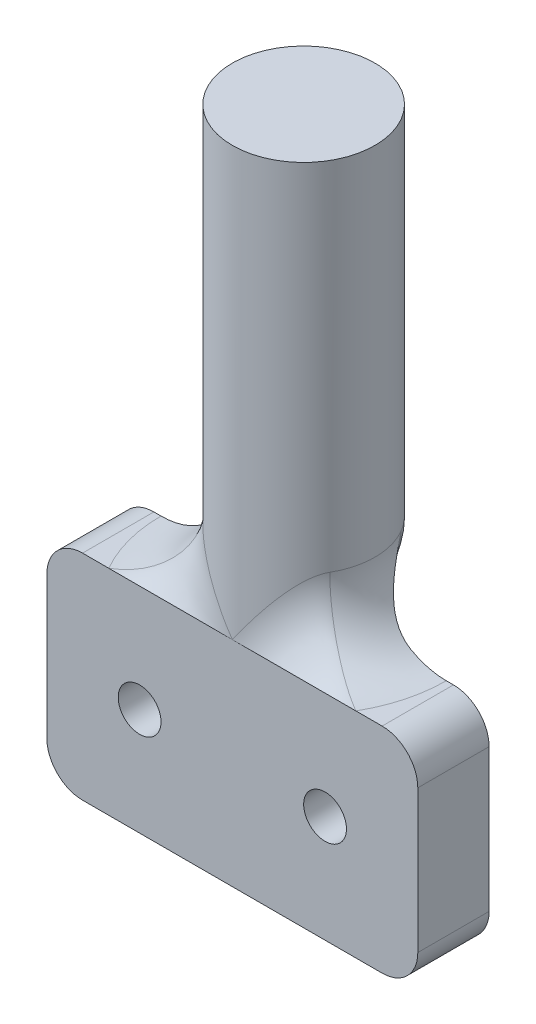
ISO-10303-21;
HEADER;
FILE_DESCRIPTION(('STEP AP214'),'2;1');
FILE_NAME('part.step','',(''),(''),'','','');
FILE_SCHEMA(('AUTOMOTIVE_DESIGN { 1 0 10303 214 1 1 1 1 }'));
ENDSEC;
DATA;
#1=APPLICATION_CONTEXT('core data for automotive mechanical design processes');
#2=APPLICATION_PROTOCOL_DEFINITION('international standard','automotive_design',2000,#1);
#3=PRODUCT_CONTEXT('',#1,'mechanical');
#4=PRODUCT('Part','Part','',(#3));
#5=PRODUCT_RELATED_PRODUCT_CATEGORY('part','',(#4));
#6=PRODUCT_DEFINITION_FORMATION('','',#4);
#7=PRODUCT_DEFINITION_CONTEXT('part definition',#1,'design');
#8=PRODUCT_DEFINITION('design','',#6,#7);
#9=PRODUCT_DEFINITION_SHAPE('','',#8);
#10=(LENGTH_UNIT() NAMED_UNIT(*) SI_UNIT(.MILLI.,.METRE.));
#11=(NAMED_UNIT(*) PLANE_ANGLE_UNIT() SI_UNIT($,.RADIAN.));
#12=(NAMED_UNIT(*) SI_UNIT($,.STERADIAN.) SOLID_ANGLE_UNIT());
#13=UNCERTAINTY_MEASURE_WITH_UNIT(LENGTH_MEASURE(1.E-05),#10,'distance_accuracy_value','');
#14=(GEOMETRIC_REPRESENTATION_CONTEXT(3) GLOBAL_UNCERTAINTY_ASSIGNED_CONTEXT((#13)) GLOBAL_UNIT_ASSIGNED_CONTEXT((#10,
#11,#12)) REPRESENTATION_CONTEXT('',''));
#15=CARTESIAN_POINT('',(0.,0.,0.));
#16=DIRECTION('',(0.,0.,1.));
#17=DIRECTION('',(1.,0.,0.));
#18=AXIS2_PLACEMENT_3D('',#15,#16,#17);
#19=CARTESIAN_POINT('',(0.,15.,5.));
#20=DIRECTION('',(0.,-1.,0.));
#21=DIRECTION('',(0.,0.,-1.));
#22=AXIS2_PLACEMENT_3D('',#19,#20,#21);
#23=PLANE('',#22);
#24=DIRECTION('',(-1.,0.,0.));
#25=VECTOR('',#24,1.);
#26=CARTESIAN_POINT('',(0.,15.,5.));
#27=LINE('',#26,#25);
#28=CARTESIAN_POINT('',(4.33974596215561,15.,5.));
#29=VERTEX_POINT('',#28);
#30=CARTESIAN_POINT('',(2.5,15.,5.));
#31=VERTEX_POINT('',#30);
#32=EDGE_CURVE('E353',#29,#31,#27,.T.);
#33=ORIENTED_EDGE('',*,*,#32,.F.);
#34=CARTESIAN_POINT('',(13.,15.,0.));
#35=DIRECTION('',(0.,-1.,0.));
#36=DIRECTION('',(0.,0.,-1.));
#37=AXIS2_PLACEMENT_3D('',#34,#35,#36);
#38=CIRCLE('',#37,10.);
#39=CARTESIAN_POINT('',(3.,15.,0.));
#40=VERTEX_POINT('',#39);
#41=EDGE_CURVE('E339',#29,#40,#38,.T.);
#42=ORIENTED_EDGE('',*,*,#41,.T.);
#43=DIRECTION('',(-1.,0.,0.));
#44=VECTOR('',#43,1.);
#45=CARTESIAN_POINT('',(0.,15.,0.));
#46=LINE('',#45,#44);
#47=CARTESIAN_POINT('',(2.5,15.,0.));
#48=VERTEX_POINT('',#47);
#49=EDGE_CURVE('E170',#40,#48,#46,.T.);
#50=ORIENTED_EDGE('',*,*,#49,.T.);
#51=DIRECTION('',(0.,0.,-1.));
#52=VECTOR('',#51,1.);
#53=CARTESIAN_POINT('',(2.5,15.,5.));
#54=LINE('',#53,#52);
#55=EDGE_CURVE('E162',#48,#31,#54,.F.);
#56=ORIENTED_EDGE('',*,*,#55,.T.);
#57=EDGE_LOOP('',(#33,#42,#50,#56));
#58=FACE_BOUND('',#57,.T.);
#59=ADVANCED_FACE('F38',(#58),#23,.F.);
#60=CARTESIAN_POINT('',(0.,0.,5.));
#61=DIRECTION('',(0.,0.,-1.));
#62=DIRECTION('',(-1.,0.,0.));
#63=AXIS2_PLACEMENT_3D('',#60,#61,#62);
#64=PLANE('',#63);
#65=DIRECTION('',(0.,1.,0.));
#66=VECTOR('',#65,1.);
#67=CARTESIAN_POINT('',(26.,0.,5.));
#68=LINE('',#67,#66);
#69=CARTESIAN_POINT('',(26.,2.5,5.));
#70=VERTEX_POINT('',#69);
#71=CARTESIAN_POINT('',(26.,12.5,5.));
#72=VERTEX_POINT('',#71);
#73=EDGE_CURVE('E359',#70,#72,#68,.T.);
#74=ORIENTED_EDGE('',*,*,#73,.T.);
#75=CARTESIAN_POINT('',(23.5,12.5,5.));
#76=DIRECTION('',(0.,0.,-1.));
#77=DIRECTION('',(-1.,0.,0.));
#78=AXIS2_PLACEMENT_3D('',#75,#76,#77);
#79=CIRCLE('',#78,2.5);
#80=CARTESIAN_POINT('',(23.5,15.,5.));
#81=VERTEX_POINT('',#80);
#82=EDGE_CURVE('E195',#72,#81,#79,.F.);
#83=ORIENTED_EDGE('',*,*,#82,.T.);
#84=CARTESIAN_POINT('',(21.6602540378444,15.,5.));
#85=VERTEX_POINT('',#84);
#86=EDGE_CURVE('E160',#81,#85,#27,.T.);
#87=ORIENTED_EDGE('',*,*,#86,.T.);
#88=CARTESIAN_POINT('',(13.,15.,5.));
#89=VERTEX_POINT('',#88);
#90=EDGE_CURVE('E352',#85,#89,#27,.T.);
#91=ORIENTED_EDGE('',*,*,#90,.T.);
#92=EDGE_CURVE('E349',#89,#29,#27,.T.);
#93=ORIENTED_EDGE('',*,*,#92,.T.);
#94=ORIENTED_EDGE('',*,*,#32,.T.);
#95=CARTESIAN_POINT('',(2.5,12.5,5.));
#96=DIRECTION('',(0.,0.,-1.));
#97=DIRECTION('',(-1.,0.,0.));
#98=AXIS2_PLACEMENT_3D('',#95,#96,#97);
#99=CIRCLE('',#98,2.5);
#100=CARTESIAN_POINT('',(0.,12.5,5.));
#101=VERTEX_POINT('',#100);
#102=EDGE_CURVE('E189',#31,#101,#99,.F.);
#103=ORIENTED_EDGE('',*,*,#102,.T.);
#104=DIRECTION('',(0.,-1.,0.));
#105=VECTOR('',#104,1.);
#106=CARTESIAN_POINT('',(0.,0.,5.));
#107=LINE('',#106,#105);
#108=CARTESIAN_POINT('',(0.,2.5,5.));
#109=VERTEX_POINT('',#108);
#110=EDGE_CURVE('E169',#101,#109,#107,.T.);
#111=ORIENTED_EDGE('',*,*,#110,.T.);
#112=CARTESIAN_POINT('',(2.5,2.5,5.));
#113=DIRECTION('',(0.,0.,-1.));
#114=DIRECTION('',(-1.,0.,0.));
#115=AXIS2_PLACEMENT_3D('',#112,#113,#114);
#116=CIRCLE('',#115,2.5);
#117=CARTESIAN_POINT('',(2.5,0.,5.));
#118=VERTEX_POINT('',#117);
#119=EDGE_CURVE('E191',#109,#118,#116,.F.);
#120=ORIENTED_EDGE('',*,*,#119,.T.);
#121=DIRECTION('',(1.,0.,0.));
#122=VECTOR('',#121,1.);
#123=CARTESIAN_POINT('',(0.,0.,5.));
#124=LINE('',#123,#122);
#125=CARTESIAN_POINT('',(23.5,0.,5.));
#126=VERTEX_POINT('',#125);
#127=EDGE_CURVE('E173',#118,#126,#124,.T.);
#128=ORIENTED_EDGE('',*,*,#127,.T.);
#129=CARTESIAN_POINT('',(23.5,2.5,5.));
#130=DIRECTION('',(0.,0.,-1.));
#131=DIRECTION('',(-1.,0.,0.));
#132=AXIS2_PLACEMENT_3D('',#129,#130,#131);
#133=CIRCLE('',#132,2.5);
#134=EDGE_CURVE('E193',#126,#70,#133,.F.);
#135=ORIENTED_EDGE('',*,*,#134,.T.);
#136=EDGE_LOOP('',(#74,#83,#87,#91,#93,#94,#103,#111,#120,#128,#135));
#137=FACE_BOUND('',#136,.T.);
#138=CARTESIAN_POINT('',(6.5,7.5,5.));
#139=DIRECTION('',(0.,0.,1.));
#140=DIRECTION('',(1.,0.,0.));
#141=AXIS2_PLACEMENT_3D('',#138,#139,#140);
#142=CIRCLE('',#141,1.5);
#143=CARTESIAN_POINT('',(8.,7.5,5.));
#144=VERTEX_POINT('',#143);
#145=EDGE_CURVE('E364',#144,#144,#142,.T.);
#146=ORIENTED_EDGE('',*,*,#145,.F.);
#147=EDGE_LOOP('',(#146));
#148=FACE_BOUND('',#147,.T.);
#149=CARTESIAN_POINT('',(19.5,7.5,5.));
#150=DIRECTION('',(0.,0.,1.));
#151=DIRECTION('',(1.,0.,0.));
#152=AXIS2_PLACEMENT_3D('',#149,#150,#151);
#153=CIRCLE('',#152,1.5);
#154=CARTESIAN_POINT('',(21.,7.5,5.));
#155=VERTEX_POINT('',#154);
#156=EDGE_CURVE('E385',#155,#155,#153,.T.);
#157=ORIENTED_EDGE('',*,*,#156,.F.);
#158=EDGE_LOOP('',(#157));
#159=FACE_BOUND('',#158,.T.);
#160=ADVANCED_FACE('F307',(#137,#148,#159),#64,.F.);
#161=CARTESIAN_POINT('',(0.,0.,0.));
#162=DIRECTION('',(0.,0.,-1.));
#163=DIRECTION('',(-1.,0.,0.));
#164=AXIS2_PLACEMENT_3D('',#161,#162,#163);
#165=PLANE('',#164);
#166=CARTESIAN_POINT('',(6.5,7.5,0.));
#167=DIRECTION('',(0.,0.,1.));
#168=DIRECTION('',(1.,0.,0.));
#169=AXIS2_PLACEMENT_3D('',#166,#167,#168);
#170=CIRCLE('',#169,1.5);
#171=CARTESIAN_POINT('',(8.,7.5,0.));
#172=VERTEX_POINT('',#171);
#173=EDGE_CURVE('E382',#172,#172,#170,.T.);
#174=ORIENTED_EDGE('',*,*,#173,.T.);
#175=EDGE_LOOP('',(#174));
#176=FACE_BOUND('',#175,.T.);
#177=CARTESIAN_POINT('',(13.,20.,0.));
#178=DIRECTION('',(0.,0.,-1.));
#179=DIRECTION('',(-1.,0.,0.));
#180=AXIS2_PLACEMENT_3D('',#177,#178,#179);
#181=CIRCLE('',#180,8.66025403784439);
#182=CARTESIAN_POINT('',(5.5,15.6698729810778,0.));
#183=VERTEX_POINT('',#182);
#184=CARTESIAN_POINT('',(13.,11.3397459621556,0.));
#185=VERTEX_POINT('',#184);
#186=EDGE_CURVE('E275',#183,#185,#181,.F.);
#187=ORIENTED_EDGE('',*,*,#186,.T.);
#188=CARTESIAN_POINT('',(13.,20.,0.));
#189=DIRECTION('',(0.,0.,-1.));
#190=DIRECTION('',(-1.,0.,0.));
#191=AXIS2_PLACEMENT_3D('',#188,#189,#190);
#192=CIRCLE('',#191,8.66025403784439);
#193=CARTESIAN_POINT('',(20.5,15.6698729810778,0.));
#194=VERTEX_POINT('',#193);
#195=EDGE_CURVE('E325',#185,#194,#192,.F.);
#196=ORIENTED_EDGE('',*,*,#195,.T.);
#197=CARTESIAN_POINT('',(23.,20.,0.));
#198=DIRECTION('',(0.,0.,-1.));
#199=DIRECTION('',(-1.,0.,0.));
#200=AXIS2_PLACEMENT_3D('',#197,#198,#199);
#201=CIRCLE('',#200,5.);
#202=CARTESIAN_POINT('',(23.,15.,0.));
#203=VERTEX_POINT('',#202);
#204=EDGE_CURVE('E168',#194,#203,#201,.F.);
#205=ORIENTED_EDGE('',*,*,#204,.T.);
#206=CARTESIAN_POINT('',(23.5,15.,0.));
#207=VERTEX_POINT('',#206);
#208=EDGE_CURVE('E157',#207,#203,#46,.T.);
#209=ORIENTED_EDGE('',*,*,#208,.F.);
#210=CARTESIAN_POINT('',(23.5,12.5,0.));
#211=DIRECTION('',(0.,0.,-1.));
#212=DIRECTION('',(-1.,0.,0.));
#213=AXIS2_PLACEMENT_3D('',#210,#211,#212);
#214=CIRCLE('',#213,2.5);
#215=CARTESIAN_POINT('',(26.,12.5,0.));
#216=VERTEX_POINT('',#215);
#217=EDGE_CURVE('E140',#207,#216,#214,.T.);
#218=ORIENTED_EDGE('',*,*,#217,.T.);
#219=DIRECTION('',(0.,1.,0.));
#220=VECTOR('',#219,1.);
#221=CARTESIAN_POINT('',(26.,0.,0.));
#222=LINE('',#221,#220);
#223=CARTESIAN_POINT('',(26.,2.5,0.));
#224=VERTEX_POINT('',#223);
#225=EDGE_CURVE('E175',#224,#216,#222,.T.);
#226=ORIENTED_EDGE('',*,*,#225,.F.);
#227=CARTESIAN_POINT('',(23.5,2.5,0.));
#228=DIRECTION('',(0.,0.,-1.));
#229=DIRECTION('',(-1.,0.,0.));
#230=AXIS2_PLACEMENT_3D('',#227,#228,#229);
#231=CIRCLE('',#230,2.5);
#232=CARTESIAN_POINT('',(23.5,0.,0.));
#233=VERTEX_POINT('',#232);
#234=EDGE_CURVE('E151',#224,#233,#231,.T.);
#235=ORIENTED_EDGE('',*,*,#234,.T.);
#236=DIRECTION('',(1.,0.,0.));
#237=VECTOR('',#236,1.);
#238=CARTESIAN_POINT('',(0.,0.,0.));
#239=LINE('',#238,#237);
#240=CARTESIAN_POINT('',(2.5,0.,0.));
#241=VERTEX_POINT('',#240);
#242=EDGE_CURVE('E363',#241,#233,#239,.T.);
#243=ORIENTED_EDGE('',*,*,#242,.F.);
#244=CARTESIAN_POINT('',(2.5,2.5,0.));
#245=DIRECTION('',(0.,0.,-1.));
#246=DIRECTION('',(-1.,0.,0.));
#247=AXIS2_PLACEMENT_3D('',#244,#245,#246);
#248=CIRCLE('',#247,2.5);
#249=CARTESIAN_POINT('',(0.,2.5,0.));
#250=VERTEX_POINT('',#249);
#251=EDGE_CURVE('E183',#241,#250,#248,.T.);
#252=ORIENTED_EDGE('',*,*,#251,.T.);
#253=DIRECTION('',(0.,-1.,0.));
#254=VECTOR('',#253,1.);
#255=CARTESIAN_POINT('',(0.,0.,0.));
#256=LINE('',#255,#254);
#257=CARTESIAN_POINT('',(0.,12.5,0.));
#258=VERTEX_POINT('',#257);
#259=EDGE_CURVE('E361',#258,#250,#256,.T.);
#260=ORIENTED_EDGE('',*,*,#259,.F.);
#261=CARTESIAN_POINT('',(2.5,12.5,0.));
#262=DIRECTION('',(0.,0.,-1.));
#263=DIRECTION('',(-1.,0.,0.));
#264=AXIS2_PLACEMENT_3D('',#261,#262,#263);
#265=CIRCLE('',#264,2.5);
#266=EDGE_CURVE('E161',#258,#48,#265,.T.);
#267=ORIENTED_EDGE('',*,*,#266,.T.);
#268=ORIENTED_EDGE('',*,*,#49,.F.);
#269=CARTESIAN_POINT('',(3.,20.,0.));
#270=DIRECTION('',(0.,0.,-1.));
#271=DIRECTION('',(-1.,0.,0.));
#272=AXIS2_PLACEMENT_3D('',#269,#270,#271);
#273=CIRCLE('',#272,5.);
#274=EDGE_CURVE('E334',#40,#183,#273,.F.);
#275=ORIENTED_EDGE('',*,*,#274,.T.);
#276=EDGE_LOOP('',(#187,#196,#205,#209,#218,#226,#235,#243,#252,#260,#267,#268,#275));
#277=FACE_BOUND('',#276,.T.);
#278=CARTESIAN_POINT('',(19.5,7.5,0.));
#279=DIRECTION('',(0.,0.,1.));
#280=DIRECTION('',(1.,0.,0.));
#281=AXIS2_PLACEMENT_3D('',#278,#279,#280);
#282=CIRCLE('',#281,1.5);
#283=CARTESIAN_POINT('',(21.,7.5,0.));
#284=VERTEX_POINT('',#283);
#285=EDGE_CURVE('E388',#284,#284,#282,.T.);
#286=ORIENTED_EDGE('',*,*,#285,.T.);
#287=EDGE_LOOP('',(#286));
#288=FACE_BOUND('',#287,.T.);
#289=ADVANCED_FACE('F164',(#176,#277,#288),#165,.T.);
#290=CARTESIAN_POINT('',(0.,0.,5.));
#291=DIRECTION('',(1.,0.,0.));
#292=DIRECTION('',(0.,0.,-1.));
#293=AXIS2_PLACEMENT_3D('',#290,#291,#292);
#294=PLANE('',#293);
#295=ORIENTED_EDGE('',*,*,#259,.T.);
#296=DIRECTION('',(0.,0.,-1.));
#297=VECTOR('',#296,1.);
#298=CARTESIAN_POINT('',(0.,2.5,5.));
#299=LINE('',#298,#297);
#300=EDGE_CURVE('E205',#250,#109,#299,.F.);
#301=ORIENTED_EDGE('',*,*,#300,.T.);
#302=ORIENTED_EDGE('',*,*,#110,.F.);
#303=DIRECTION('',(0.,0.,-1.));
#304=VECTOR('',#303,1.);
#305=CARTESIAN_POINT('',(0.,12.5,5.));
#306=LINE('',#305,#304);
#307=EDGE_CURVE('E202',#101,#258,#306,.T.);
#308=ORIENTED_EDGE('',*,*,#307,.T.);
#309=EDGE_LOOP('',(#295,#301,#302,#308));
#310=FACE_BOUND('',#309,.T.);
#311=ADVANCED_FACE('F416',(#310),#294,.F.);
#312=CARTESIAN_POINT('',(0.,0.,5.));
#313=DIRECTION('',(0.,1.,0.));
#314=DIRECTION('',(0.,0.,1.));
#315=AXIS2_PLACEMENT_3D('',#312,#313,#314);
#316=PLANE('',#315);
#317=ORIENTED_EDGE('',*,*,#242,.T.);
#318=DIRECTION('',(0.,0.,-1.));
#319=VECTOR('',#318,1.);
#320=CARTESIAN_POINT('',(23.5,0.,5.));
#321=LINE('',#320,#319);
#322=EDGE_CURVE('E200',#233,#126,#321,.F.);
#323=ORIENTED_EDGE('',*,*,#322,.T.);
#324=ORIENTED_EDGE('',*,*,#127,.F.);
#325=DIRECTION('',(0.,0.,-1.));
#326=VECTOR('',#325,1.);
#327=CARTESIAN_POINT('',(2.5,0.,5.));
#328=LINE('',#327,#326);
#329=EDGE_CURVE('E197',#118,#241,#328,.T.);
#330=ORIENTED_EDGE('',*,*,#329,.T.);
#331=EDGE_LOOP('',(#317,#323,#324,#330));
#332=FACE_BOUND('',#331,.T.);
#333=ADVANCED_FACE('F378',(#332),#316,.F.);
#334=CARTESIAN_POINT('',(26.,0.,5.));
#335=DIRECTION('',(-1.,0.,0.));
#336=DIRECTION('',(0.,0.,1.));
#337=AXIS2_PLACEMENT_3D('',#334,#335,#336);
#338=PLANE('',#337);
#339=ORIENTED_EDGE('',*,*,#225,.T.);
#340=DIRECTION('',(0.,0.,-1.));
#341=VECTOR('',#340,1.);
#342=CARTESIAN_POINT('',(26.,12.5,5.));
#343=LINE('',#342,#341);
#344=EDGE_CURVE('E145',#216,#72,#343,.F.);
#345=ORIENTED_EDGE('',*,*,#344,.T.);
#346=ORIENTED_EDGE('',*,*,#73,.F.);
#347=DIRECTION('',(0.,0.,-1.));
#348=VECTOR('',#347,1.);
#349=CARTESIAN_POINT('',(26.,2.5,5.));
#350=LINE('',#349,#348);
#351=EDGE_CURVE('E150',#70,#224,#350,.T.);
#352=ORIENTED_EDGE('',*,*,#351,.T.);
#353=EDGE_LOOP('',(#339,#345,#346,#352));
#354=FACE_BOUND('',#353,.T.);
#355=ADVANCED_FACE('F370',(#354),#338,.F.);
#356=ORIENTED_EDGE('',*,*,#208,.T.);
#357=CARTESIAN_POINT('',(13.,15.,0.));
#358=DIRECTION('',(0.,-1.,0.));
#359=DIRECTION('',(0.,0.,-1.));
#360=AXIS2_PLACEMENT_3D('',#357,#358,#359);
#361=CIRCLE('',#360,10.);
#362=EDGE_CURVE('E335',#203,#85,#361,.T.);
#363=ORIENTED_EDGE('',*,*,#362,.T.);
#364=ORIENTED_EDGE('',*,*,#86,.F.);
#365=DIRECTION('',(0.,0.,-1.));
#366=VECTOR('',#365,1.);
#367=CARTESIAN_POINT('',(23.5,15.,5.));
#368=LINE('',#367,#366);
#369=EDGE_CURVE('E144',#81,#207,#368,.T.);
#370=ORIENTED_EDGE('',*,*,#369,.T.);
#371=EDGE_LOOP('',(#356,#363,#364,#370));
#372=FACE_BOUND('',#371,.T.);
#373=ADVANCED_FACE('F156',(#372),#23,.F.);
#374=CARTESIAN_POINT('',(6.5,7.5,5.));
#375=DIRECTION('',(0.,0.,-1.));
#376=DIRECTION('',(-1.,0.,0.));
#377=AXIS2_PLACEMENT_3D('',#374,#375,#376);
#378=CYLINDRICAL_SURFACE('',#377,1.5);
#379=ORIENTED_EDGE('',*,*,#145,.T.);
#380=EDGE_LOOP('',(#379));
#381=FACE_BOUND('',#380,.T.);
#382=ORIENTED_EDGE('',*,*,#173,.F.);
#383=EDGE_LOOP('',(#382));
#384=FACE_BOUND('',#383,.T.);
#385=ADVANCED_FACE('F407',(#381,#384),#378,.F.);
#386=CARTESIAN_POINT('',(19.5,7.5,5.));
#387=DIRECTION('',(0.,0.,-1.));
#388=DIRECTION('',(-1.,0.,0.));
#389=AXIS2_PLACEMENT_3D('',#386,#387,#388);
#390=CYLINDRICAL_SURFACE('',#389,1.5);
#391=ORIENTED_EDGE('',*,*,#156,.T.);
#392=EDGE_LOOP('',(#391));
#393=FACE_BOUND('',#392,.T.);
#394=ORIENTED_EDGE('',*,*,#285,.F.);
#395=EDGE_LOOP('',(#394));
#396=FACE_BOUND('',#395,.T.);
#397=ADVANCED_FACE('F236',(#393,#396),#390,.F.);
#398=CARTESIAN_POINT('',(23.5,12.5,5.));
#399=DIRECTION('',(0.,0.,-1.));
#400=DIRECTION('',(-1.,0.,0.));
#401=AXIS2_PLACEMENT_3D('',#398,#399,#400);
#402=CYLINDRICAL_SURFACE('',#401,2.5);
#403=ORIENTED_EDGE('',*,*,#82,.F.);
#404=ORIENTED_EDGE('',*,*,#344,.F.);
#405=ORIENTED_EDGE('',*,*,#217,.F.);
#406=ORIENTED_EDGE('',*,*,#369,.F.);
#407=EDGE_LOOP('',(#403,#404,#405,#406));
#408=FACE_BOUND('',#407,.T.);
#409=ADVANCED_FACE('F143',(#408),#402,.T.);
#410=CARTESIAN_POINT('',(23.5,2.5,5.));
#411=DIRECTION('',(0.,0.,-1.));
#412=DIRECTION('',(-1.,0.,0.));
#413=AXIS2_PLACEMENT_3D('',#410,#411,#412);
#414=CYLINDRICAL_SURFACE('',#413,2.5);
#415=ORIENTED_EDGE('',*,*,#134,.F.);
#416=ORIENTED_EDGE('',*,*,#322,.F.);
#417=ORIENTED_EDGE('',*,*,#234,.F.);
#418=ORIENTED_EDGE('',*,*,#351,.F.);
#419=EDGE_LOOP('',(#415,#416,#417,#418));
#420=FACE_BOUND('',#419,.T.);
#421=ADVANCED_FACE('F375',(#420),#414,.T.);
#422=CARTESIAN_POINT('',(2.5,2.5,5.));
#423=DIRECTION('',(0.,0.,-1.));
#424=DIRECTION('',(-1.,0.,0.));
#425=AXIS2_PLACEMENT_3D('',#422,#423,#424);
#426=CYLINDRICAL_SURFACE('',#425,2.5);
#427=ORIENTED_EDGE('',*,*,#119,.F.);
#428=ORIENTED_EDGE('',*,*,#300,.F.);
#429=ORIENTED_EDGE('',*,*,#251,.F.);
#430=ORIENTED_EDGE('',*,*,#329,.F.);
#431=EDGE_LOOP('',(#427,#428,#429,#430));
#432=FACE_BOUND('',#431,.T.);
#433=ADVANCED_FACE('F426',(#432),#426,.T.);
#434=CARTESIAN_POINT('',(2.5,12.5,5.));
#435=DIRECTION('',(0.,0.,-1.));
#436=DIRECTION('',(-1.,0.,0.));
#437=AXIS2_PLACEMENT_3D('',#434,#435,#436);
#438=CYLINDRICAL_SURFACE('',#437,2.5);
#439=ORIENTED_EDGE('',*,*,#102,.F.);
#440=ORIENTED_EDGE('',*,*,#55,.F.);
#441=ORIENTED_EDGE('',*,*,#266,.F.);
#442=ORIENTED_EDGE('',*,*,#307,.F.);
#443=EDGE_LOOP('',(#439,#440,#441,#442));
#444=FACE_BOUND('',#443,.T.);
#445=ADVANCED_FACE('F234',(#444),#438,.T.);
#446=CARTESIAN_POINT('',(13.,45.,0.));
#447=DIRECTION('',(0.,-1.,0.));
#448=DIRECTION('',(0.,0.,-1.));
#449=AXIS2_PLACEMENT_3D('',#446,#447,#448);
#450=CYLINDRICAL_SURFACE('',#449,5.);
#451=CARTESIAN_POINT('',(13.,45.,0.));
#452=DIRECTION('',(0.,1.,0.));
#453=DIRECTION('',(0.,0.,1.));
#454=AXIS2_PLACEMENT_3D('',#451,#452,#453);
#455=CIRCLE('',#454,5.);
#456=CARTESIAN_POINT('',(13.,45.,5.));
#457=VERTEX_POINT('',#456);
#458=EDGE_CURVE('E319',#457,#457,#455,.T.);
#459=ORIENTED_EDGE('',*,*,#458,.F.);
#460=EDGE_LOOP('',(#459));
#461=FACE_BOUND('',#460,.T.);
#462=CARTESIAN_POINT('',(13.,20.,0.));
#463=DIRECTION('',(0.,-1.,0.));
#464=DIRECTION('',(0.,0.,-1.));
#465=AXIS2_PLACEMENT_3D('',#462,#463,#464);
#466=CIRCLE('',#465,5.);
#467=CARTESIAN_POINT('',(17.3301270189222,20.,2.5));
#468=VERTEX_POINT('',#467);
#469=CARTESIAN_POINT('',(17.3301270189222,20.,-2.5));
#470=VERTEX_POINT('',#469);
#471=EDGE_CURVE('E56',#468,#470,#466,.F.);
#472=ORIENTED_EDGE('',*,*,#471,.T.);
#473=CARTESIAN_POINT('',(13.,20.,0.));
#474=DIRECTION('',(0.,-1.,0.));
#475=DIRECTION('',(0.,0.,-1.));
#476=AXIS2_PLACEMENT_3D('',#473,#474,#475);
#477=CIRCLE('',#476,5.);
#478=CARTESIAN_POINT('',(8.66987298107781,20.,-2.5));
#479=VERTEX_POINT('',#478);
#480=EDGE_CURVE('E207',#470,#479,#477,.F.);
#481=ORIENTED_EDGE('',*,*,#480,.T.);
#482=CARTESIAN_POINT('',(13.,20.,0.));
#483=DIRECTION('',(0.,-1.,0.));
#484=DIRECTION('',(0.,0.,-1.));
#485=AXIS2_PLACEMENT_3D('',#482,#483,#484);
#486=CIRCLE('',#485,5.);
#487=CARTESIAN_POINT('',(8.66987298107781,20.,2.5));
#488=VERTEX_POINT('',#487);
#489=EDGE_CURVE('E340',#479,#488,#486,.F.);
#490=ORIENTED_EDGE('',*,*,#489,.T.);
#491=CARTESIAN_POINT('',(8.44195994437424,19.9202620544522,2.05530310448633));
#492=CARTESIAN_POINT('',(8.80153048112986,14.6118548221809,2.85272169728535));
#493=CARTESIAN_POINT('',(3.88391988874849,15.,5.));
#494=CARTESIAN_POINT('',(8.48043303750433,19.9511499452849,2.14068643796849));
#495=CARTESIAN_POINT('',(8.77880872442267,14.6718256752968,2.76216809026848));
#496=CARTESIAN_POINT('',(3.96086607500863,15.,5.));
#497=CARTESIAN_POINT('',(8.52162183339983,19.9726365315721,2.22556331343184));
#498=CARTESIAN_POINT('',(8.7529998938867,14.7417614429014,2.68417100553671));
#499=CARTESIAN_POINT('',(4.04324366679963,15.,5.));
#500=CARTESIAN_POINT('',(8.60890414071584,19.9982438378198,2.39314114433354));
#501=CARTESIAN_POINT('',(8.70170792625993,14.8931099834088,2.55728084793841));
#502=CARTESIAN_POINT('',(4.21780828143168,15.,5.));
#503=CARTESIAN_POINT('',(8.65498370900732,20.0024126342168,2.47584748944671));
#504=CARTESIAN_POINT('',(8.67629237932178,14.9741094331225,2.50806837066561));
#505=CARTESIAN_POINT('',(4.30996741801466,15.,5.));
#506=CARTESIAN_POINT('',(8.79392337998744,19.9917340834465,2.70927948247871));
#507=CARTESIAN_POINT('',(8.61249452582053,15.2105816882442,2.41098053181199));
#508=CARTESIAN_POINT('',(4.58784675997486,15.,5.));
#509=CARTESIAN_POINT('',(8.89253874511008,19.9571354014968,2.85643120324117));
#510=CARTESIAN_POINT('',(8.58097592420278,15.3714632454671,2.39816147342421));
#511=CARTESIAN_POINT('',(4.78507749022,15.,5.));
#512=CARTESIAN_POINT('',(9.1025299437112,19.843501035599,3.13698820397232));
#513=CARTESIAN_POINT('',(8.56262127421029,15.6662457386049,2.45656307356089));
#514=CARTESIAN_POINT('',(5.20505988742256,15.,5.));
#515=CARTESIAN_POINT('',(9.21394954582881,19.7643090922455,3.27034318293193));
#516=CARTESIAN_POINT('',(8.57444618560457,15.8005731903149,2.52514010962124));
#517=CARTESIAN_POINT('',(5.42789909165821,15.,5.));
#518=CARTESIAN_POINT('',(9.48949601569641,19.5357179711413,3.56809882852757));
#519=CARTESIAN_POINT('',(8.66091472554572,16.0627013413032,2.74390337689512));
#520=CARTESIAN_POINT('',(5.97899203139202,15.,5.));
#521=CARTESIAN_POINT('',(9.65784067885019,19.3711717024033,3.72566075851406));
#522=CARTESIAN_POINT('',(8.75433851722235,16.1753242495986,2.91329500352805));
#523=CARTESIAN_POINT('',(6.31568135769681,15.,5.));
#524=CARTESIAN_POINT('',(10.0066191146274,18.9975594925775,4.01132385557012));
#525=CARTESIAN_POINT('',(9.01961965121259,16.3116427640292,3.27263817313337));
#526=CARTESIAN_POINT('',(7.01323822925846,15.,5.));
#527=CARTESIAN_POINT('',(10.1870719346716,18.7884222239224,4.13937712965506));
#528=CARTESIAN_POINT('',(9.18904006576446,16.3391137763048,3.46262219561566));
#529=CARTESIAN_POINT('',(7.37414386935663,15.,5.));
#530=CARTESIAN_POINT('',(10.5017991497945,18.4056738244635,4.33387258417418));
#531=CARTESIAN_POINT('',(9.52669490284049,16.3268146293075,3.77243011188368));
#532=CARTESIAN_POINT('',(8.00359829957934,15.,5.));
#533=CARTESIAN_POINT('',(10.6341136485614,18.2396055408561,4.40737391196365));
#534=CARTESIAN_POINT('',(9.67927024031462,16.3054151043712,3.89615950634731));
#535=CARTESIAN_POINT('',(8.26822729709203,15.,5.));
#536=CARTESIAN_POINT('',(10.901813571514,17.8958440278793,4.54092504491246));
#537=CARTESIAN_POINT('',(10.0050491525105,16.2356318598458,4.12772386940433));
#538=CARTESIAN_POINT('',(8.80362714299848,15.,5.));
#539=CARTESIAN_POINT('',(11.0372003872744,17.7181454591506,4.60096861497079));
#540=CARTESIAN_POINT('',(10.1784071796365,16.1876518475126,4.23626010253703));
#541=CARTESIAN_POINT('',(9.07440077454165,15.,5.));
#542=CARTESIAN_POINT('',(11.3101788353066,17.3541760796535,4.708078675522));
#543=CARTESIAN_POINT('',(10.5401101214765,16.0711934166957,4.43321995617232));
#544=CARTESIAN_POINT('',(9.62035767062034,15.,5.));
#545=CARTESIAN_POINT('',(11.4477705925739,17.1679047817791,4.75514442754501));
#546=CARTESIAN_POINT('',(10.7288520401001,16.0028361899608,4.52230897361374));
#547=CARTESIAN_POINT('',(9.89554118514674,15.,5.));
#548=CARTESIAN_POINT('',(11.7244752854001,16.789270049503,4.83671705131449));
#549=CARTESIAN_POINT('',(11.1166669186331,15.8513860191714,4.67816780468817));
#550=CARTESIAN_POINT('',(10.4489505707956,15.,5.));
#551=CARTESIAN_POINT('',(11.863587679013,16.5969087419948,4.87122825618364));
#552=CARTESIAN_POINT('',(11.3162974391486,15.7682091165779,4.74549262457121));
#553=CARTESIAN_POINT('',(10.7271753580261,15.,5.));
#554=CARTESIAN_POINT('',(12.1671671716195,16.1742290005612,4.93298978907587));
#555=CARTESIAN_POINT('',(11.7571546820079,15.5769093036488,4.86632253464833));
#556=CARTESIAN_POINT('',(11.334334343239,15.,5.));
#557=CARTESIAN_POINT('',(12.3318327667238,15.9431317877623,4.95793064684535));
#558=CARTESIAN_POINT('',(12.00095753234,15.46644964044,4.91607605297541));
#559=CARTESIAN_POINT('',(11.6636655334407,15.,5.));
#560=CARTESIAN_POINT('',(12.6616342693268,15.4785078022004,4.99128497508588));
#561=CARTESIAN_POINT('',(12.4918638846655,15.2395006407501,4.98244888482995));
#562=CARTESIAN_POINT('',(12.3232685386468,15.,5.));
#563=CARTESIAN_POINT('',(12.8267690605856,15.2449853236506,4.99972386277895));
#564=CARTESIAN_POINT('',(12.7401440788685,15.1224966562075,4.99944608365095));
#565=CARTESIAN_POINT('',(12.6535381211711,15.,5.));
#566=CARTESIAN_POINT('',(12.9945567082079,15.0076979767969,4.99999777646746));
#567=CARTESIAN_POINT('',(12.9918350595878,15.0038489899303,4.99999557964991));
#568=CARTESIAN_POINT('',(12.9891134164158,15.,5.));
#569=CARTESIAN_POINT('',(12.9972783644226,15.0038489736552,4.99999999860799));
#570=CARTESIAN_POINT('',(12.9959175466339,15.0019244870827,5.00000002483901));
#571=CARTESIAN_POINT('',(12.9945567288452,15.,5.));
#572=CARTESIAN_POINT('',(13.,15.,5.));
#573=CARTESIAN_POINT('',(13.,15.,5.));
#574=CARTESIAN_POINT('',(13.,15.,5.));
#575=(BOUNDED_SURFACE() B_SPLINE_SURFACE(3,2,((#491,#492,#493),(#494,#495,#496),(#497,#498,
#499),(#500,#501,#502),(#503,#504,#505),(#506,#507,#508),(#509,#510,#511),(#512,#513,#514),
(#515,#516,#517),(#518,#519,#520),(#521,#522,#523),(#524,#525,#526),(#527,#528,#529),(#530,#531,
#532),(#533,#534,#535),(#536,#537,#538),(#539,#540,#541),(#542,#543,#544),(#545,#546,#547),
(#548,#549,#550),(#551,#552,#553),(#554,#555,#556),(#557,#558,#559),(#560,#561,#562),(#563,#564,
#565),(#566,#567,#568),(#569,#570,#571),(#572,#573,#574)),.UNSPECIFIED.,.F.,.F.,
.F.) B_SPLINE_SURFACE_WITH_KNOTS((4,2,2,2,2,2,2,2,2,2,2,2,2,4),(3,3),(0.,0.568793207569174,
1.1360063116335,2.19781568087333,3.26336910264896,4.72426754404271,6.18752060289797,
7.22207784030412,8.25711341116543,9.29220786595557,10.3269447247147,11.5417911059918,
12.7547648370551,12.7747648414995),(0.,1.),
.UNSPECIFIED.) GEOMETRIC_REPRESENTATION_ITEM() RATIONAL_B_SPLINE_SURFACE(((1.,0.680764660953999,
1.),(1.,0.684796528768826,1.),(1.,0.689427813457756,1.),(1.,0.699656894280331,1.),(1.,
0.705251969711266,1.),(1.,0.722410830656439,1.),(1.,0.73492501611774,1.),(1.,0.761122822435041,
1.),(1.,0.774810411250185,1.),(1.,0.807219709513824,1.),(1.,0.825924985565306,1.),(1.,
0.861392507492273,1.),(1.,0.87815157307772,1.),(1.,0.904307667495827,1.),(1.,0.914423086783384,
1.),(1.,0.93306774592078,1.),(1.,0.941596250229083,1.),(1.,0.956962413656766,1.),(1.,
0.963799976555127,1.),(1.,0.975730886647993,1.),(1.,0.980824835603915,1.),(1.,0.989977933965968,
1.),(1.,0.993702626632032,1.),(1.,0.998691042968104,1.),(1.,0.999958551299578,1.),(1.,
0.999999666934123,1.),(1.,1.00000000027104,1.),(1.,1.,1.))) REPRESENTATION_ITEM('') SURFACE());
#576=CARTESIAN_POINT('',(8.44195994437424,19.9202620544522,2.05530310448633));
#577=CARTESIAN_POINT('',(8.48043303750433,19.9511499452849,2.14068643796849));
#578=CARTESIAN_POINT('',(8.52162183339983,19.9726365315721,2.22556331343184));
#579=CARTESIAN_POINT('',(8.60890414071584,19.9982438378198,2.39314114433354));
#580=CARTESIAN_POINT('',(8.65498370900732,20.0024126342168,2.47584748944671));
#581=CARTESIAN_POINT('',(8.79392337998744,19.9917340834465,2.70927948247871));
#582=CARTESIAN_POINT('',(8.89253874511008,19.9571354014968,2.85643120324117));
#583=CARTESIAN_POINT('',(9.1025299437112,19.843501035599,3.13698820397232));
#584=CARTESIAN_POINT('',(9.21394954582881,19.7643090922455,3.27034318293193));
#585=CARTESIAN_POINT('',(9.48949601569641,19.5357179711413,3.56809882852757));
#586=CARTESIAN_POINT('',(9.65784067885019,19.3711717024033,3.72566075851406));
#587=CARTESIAN_POINT('',(10.0066191146275,18.9975594925775,4.01132385557012));
#588=CARTESIAN_POINT('',(10.1870719346716,18.7884222239224,4.13937712965506));
#589=CARTESIAN_POINT('',(10.5017991497945,18.4056738244635,4.33387258417418));
#590=CARTESIAN_POINT('',(10.6341136485614,18.2396055408561,4.40737391196365));
#591=CARTESIAN_POINT('',(10.901813571514,17.8958440278793,4.54092504491246));
#592=CARTESIAN_POINT('',(11.0372003872744,17.7181454591506,4.60096861497079));
#593=CARTESIAN_POINT('',(11.3101788353066,17.3541760796535,4.708078675522));
#594=CARTESIAN_POINT('',(11.4477705925739,17.1679047817791,4.75514442754501));
#595=CARTESIAN_POINT('',(11.7244752854001,16.789270049503,4.83671705131449));
#596=CARTESIAN_POINT('',(11.863587679013,16.5969087419948,4.87122825618364));
#597=CARTESIAN_POINT('',(12.1671671716195,16.1742290005612,4.93298978907587));
#598=CARTESIAN_POINT('',(12.3318327667237,15.9431317877623,4.95793064684535));
#599=CARTESIAN_POINT('',(12.6616342693268,15.4785078022004,4.99128497508589));
#600=CARTESIAN_POINT('',(12.8267690605856,15.2449853236506,4.99972386277895));
#601=CARTESIAN_POINT('',(12.9945567082079,15.0076979767969,4.99999777646746));
#602=CARTESIAN_POINT('',(12.9972783644226,15.0038489736552,4.99999999860799));
#603=CARTESIAN_POINT('',(13.,15.,5.));
#604=B_SPLINE_CURVE_WITH_KNOTS('',3,(#576,#577,#578,#579,#580,#581,#582,#583,#584,#585,#586,
#587,#588,#589,#590,#591,#592,#593,#594,#595,#596,#597,#598,#599,#600,#601,#602,#603),
.UNSPECIFIED.,.F.,.F.,(4,2,2,2,2,2,2,2,2,2,2,2,2,4),(0.,0.568793207569174,1.1360063116335,
2.19781568087333,3.26336910264896,4.72426754404271,6.18752060289797,7.22207784030412,
8.25711341116543,9.29220786595557,10.3269447247147,11.5417911059918,12.7547648370551,
12.7747648414995),.UNSPECIFIED.);
#605=EDGE_CURVE('E218',#488,#89,#604,.T.);
#606=ORIENTED_EDGE('',*,*,#605,.T.);
#607=CARTESIAN_POINT('',(22.116080111126,15.,5.));
#608=CARTESIAN_POINT('',(17.1984695189075,14.6118548222796,2.8527216971376));
#609=CARTESIAN_POINT('',(17.558040055563,19.9202620545025,2.05530310462548));
#610=CARTESIAN_POINT('',(22.0391323690002,15.,5.));
#611=CARTESIAN_POINT('',(17.2211917361429,14.6718268734982,2.76216623183616));
#612=CARTESIAN_POINT('',(17.5195661845001,19.9511505732414,2.14068816942576));
#613=CARTESIAN_POINT('',(21.9567529979356,15.,5.));
#614=CARTESIAN_POINT('',(17.2470011446667,14.7417642491121,2.6841678467967));
#615=CARTESIAN_POINT('',(17.4783764989678,19.9726374031253,2.22556675250503));
#616=CARTESIAN_POINT('',(21.7821844556471,15.,5.));
#617=CARTESIAN_POINT('',(17.2982941308682,14.8931163063534,2.55727632101809));
#618=CARTESIAN_POINT('',(17.3910922278235,19.9982445228146,2.39314788130317));
#619=CARTESIAN_POINT('',(21.6900231733296,15.,5.));
#620=CARTESIAN_POINT('',(17.3237101168052,14.974117641176,2.50806374902878));
#621=CARTESIAN_POINT('',(17.3450115866648,20.0024128936293,2.47585581727675));
#622=CARTESIAN_POINT('',(21.412140230903,15.,5.));
#623=CARTESIAN_POINT('',(17.3875078900308,15.2105924979503,2.41097837180205));
#624=CARTESIAN_POINT('',(17.2060701154515,19.9917324217774,2.70928961955078));
#625=CARTESIAN_POINT('',(21.21490817732,15.,5.));
#626=CARTESIAN_POINT('',(17.4190257876483,15.3714743702281,2.39816153997289));
#627=CARTESIAN_POINT('',(17.1074540886599,19.9571324579302,2.85644153849876));
#628=CARTESIAN_POINT('',(20.7949231241484,15.,5.));
#629=CARTESIAN_POINT('',(17.4373784036987,15.6662565679163,2.45656731518112));
#630=CARTESIAN_POINT('',(16.8974615620743,19.8434954985186,3.13699878506213));
#631=CARTESIAN_POINT('',(20.5720825868808,15.,5.));
#632=CARTESIAN_POINT('',(17.4255521905211,15.8005834522907,2.52514629424846));
#633=CARTESIAN_POINT('',(16.7860412934407,19.764302242756,3.27035381089963));
#634=CARTESIAN_POINT('',(20.0209862096319,15.,5.));
#635=CARTESIAN_POINT('',(17.3390802039545,16.0627097518396,2.74391351890954));
#636=CARTESIAN_POINT('',(16.5104931048156,19.5357079155034,3.5681095868889));
#637=CARTESIAN_POINT('',(19.6842947557183,15.,5.));
#638=CARTESIAN_POINT('',(17.2456540569922,16.1753311169415,2.91330705254417));
#639=CARTESIAN_POINT('',(16.3421473778574,19.3711597028083,3.72567151735437));
#640=CARTESIAN_POINT('',(18.9867336604636,15.,5.));
#641=CARTESIAN_POINT('',(16.9803680865159,16.311646101963,3.27265285438219));
#642=CARTESIAN_POINT('',(15.9933668302336,18.9975436416901,4.01133438584345));
#643=CARTESIAN_POINT('',(18.6258259241345,15.,5.));
#644=CARTESIAN_POINT('',(16.8109451700851,16.3391151442422,3.46263767348877));
#645=CARTESIAN_POINT('',(15.812912962074,18.7884044653768,4.13938743024888));
#646=CARTESIAN_POINT('',(17.9963680940009,15.,5.));
#647=CARTESIAN_POINT('',(16.4732862390189,16.3268126261027,3.77244607216451));
#648=CARTESIAN_POINT('',(15.4981840469957,18.4056529614893,4.33388228499567));
#649=CARTESIAN_POINT('',(17.7317377831299,15.,5.));
#650=CARTESIAN_POINT('',(16.3207092871294,16.305411723538,3.89617541479271));
#651=CARTESIAN_POINT('',(15.3658688915495,18.2395834676955,4.40738329874526));
#652=CARTESIAN_POINT('',(17.1963353437978,15.,5.));
#653=CARTESIAN_POINT('',(15.9949272652143,16.2356258246249,4.1277393051444));
#654=CARTESIAN_POINT('',(15.0981676718841,17.8958195937301,4.54093372550131));
#655=CARTESIAN_POINT('',(16.9255604321958,15.,5.));
#656=CARTESIAN_POINT('',(15.8215677275635,16.1876445251244,4.23627512604273));
#657=CARTESIAN_POINT('',(14.9627802160943,17.7181198742132,4.60097690335438));
#658=CARTESIAN_POINT('',(16.3796010267602,15.,5.));
#659=CARTESIAN_POINT('',(15.4598619085417,16.0711836652477,4.43323384656934));
#660=CARTESIAN_POINT('',(14.6898005133837,17.3541482678997,4.70808610077821));
#661=CARTESIAN_POINT('',(16.1044162831842,15.,5.));
#662=CARTESIAN_POINT('',(15.2711186097424,16.0028252869127,4.52232214735185));
#663=CARTESIAN_POINT('',(14.5522081415916,17.1678758944811,4.75515138260282));
#664=CARTESIAN_POINT('',(15.5510044776958,15.,5.));
#665=CARTESIAN_POINT('',(14.8833011141207,15.851372983225,4.67817929018301));
#666=CARTESIAN_POINT('',(14.2755022388456,16.7892390822641,4.83672299150319));
#667=CARTESIAN_POINT('',(15.272778499691,15.,5.));
#668=CARTESIAN_POINT('',(14.6836693434264,15.7681950892346,4.74550313766466));
#669=CARTESIAN_POINT('',(14.1363892498455,16.5968767703899,4.87123365183855));
#670=CARTESIAN_POINT('',(14.6656261010546,15.,5.));
#671=CARTESIAN_POINT('',(14.242816112106,15.5768961806202,4.86632890175453));
#672=CARTESIAN_POINT('',(13.8328130505272,16.1742012863418,4.93299298822111));
#673=CARTESIAN_POINT('',(14.3363027772585,15.,5.));
#674=CARTESIAN_POINT('',(13.9990189300217,15.4664388664585,4.91608003442793));
#675=CARTESIAN_POINT('',(13.6681513886259,15.9431095084539,4.95793264761884));
#676=CARTESIAN_POINT('',(13.6767155828062,15.,5.));
#677=CARTESIAN_POINT('',(13.5081241633834,15.2394950082653,4.98244970676725));
#678=CARTESIAN_POINT('',(13.3383577913997,15.4784965749697,4.99128538043301));
#679=CARTESIAN_POINT('',(13.3464539444212,15.,5.));
#680=CARTESIAN_POINT('',(13.2598499698545,15.1224938507617,4.99944609670674));
#681=CARTESIAN_POINT('',(13.1732269722105,15.2449797131804,4.99972386925067));
#682=CARTESIAN_POINT('',(13.010886583585,15.,5.));
#683=CARTESIAN_POINT('',(13.0081649404129,15.0038489899306,4.99999557964887));
#684=CARTESIAN_POINT('',(13.0054432917925,15.0076979767975,4.99999777646754));
#685=CARTESIAN_POINT('',(13.0054432711556,15.,5.));
#686=CARTESIAN_POINT('',(13.0040824533668,15.001924487083,5.00000002483795));
#687=CARTESIAN_POINT('',(13.0027216355778,15.0038489736558,4.99999999860807));
#688=CARTESIAN_POINT('',(13.,15.,5.));
#689=CARTESIAN_POINT('',(13.,15.,5.));
#690=CARTESIAN_POINT('',(13.,15.,5.));
#691=(BOUNDED_SURFACE() B_SPLINE_SURFACE(3,2,((#607,#608,#609),(#610,#611,#612),(#613,#614,
#615),(#616,#617,#618),(#619,#620,#621),(#622,#623,#624),(#625,#626,#627),(#628,#629,#630),
(#631,#632,#633),(#634,#635,#636),(#637,#638,#639),(#640,#641,#642),(#643,#644,#645),(#646,#647,
#648),(#649,#650,#651),(#652,#653,#654),(#655,#656,#657),(#658,#659,#660),(#661,#662,#663),
(#664,#665,#666),(#667,#668,#669),(#670,#671,#672),(#673,#674,#675),(#676,#677,#678),(#679,#680,
#681),(#682,#683,#684),(#685,#686,#687),(#688,#689,#690)),.UNSPECIFIED.,.F.,.F.,
.F.) B_SPLINE_SURFACE_WITH_KNOTS((4,2,2,2,2,2,2,2,2,2,2,2,2,4),(3,3),(0.,0.568804709548009,
1.13602919449181,2.19784211030229,3.2633991080683,4.72430386717077,6.18756326676891,
7.22212446404269,8.25716399785184,9.2922623577655,10.3270031111162,11.5418202513771,
12.7547648299551,12.7747648343996),(0.,1.),
.UNSPECIFIED.) GEOMETRIC_REPRESENTATION_ITEM() RATIONAL_B_SPLINE_SURFACE(((1.,0.680764660960583,
1.),(1.,0.684796610060153,1.),(1.,0.68942800078696,1.),(1.,0.699657327792818,1.),(1.,
0.705252543118074,1.),(1.,0.722411648537763,1.),(1.,0.734925920039343,1.),(1.,0.761123872187742,
1.),(1.,0.774811520717299,1.),(1.,0.80722094588534,1.),(1.,0.82592627687778,1.),(1.,
0.861393859213057,1.),(1.,0.87815293016835,1.),(1.,0.904308991539931,1.),(1.,0.91442438389961,
1.),(1.,0.933068971228756,1.),(1.,0.941597430646466,1.),(1.,0.956963487475249,1.),(1.,
0.963800988759232,1.),(1.,0.975731760494635,1.),(1.,0.980825632728137,1.),(1.,0.989978411062987,
1.),(1.,0.993702925517073,1.),(1.,0.99869110392589,1.),(1.,0.999958552272232,1.),(1.,
0.999999666934115,1.),(1.,1.00000000027103,1.),(1.,1.,1.))) REPRESENTATION_ITEM('') SURFACE());
#692=CARTESIAN_POINT('',(17.558040055563,19.9202620545025,2.05530310462548));
#693=CARTESIAN_POINT('',(17.5195661845001,19.9511505732414,2.14068816942576));
#694=CARTESIAN_POINT('',(17.4783764989678,19.9726374031253,2.22556675250503));
#695=CARTESIAN_POINT('',(17.3910922278236,19.9982445228146,2.39314788130317));
#696=CARTESIAN_POINT('',(17.3450115866648,20.0024128936293,2.47585581727675));
#697=CARTESIAN_POINT('',(17.2060701154515,19.9917324217774,2.70928961955078));
#698=CARTESIAN_POINT('',(17.1074540886599,19.9571324579302,2.85644153849876));
#699=CARTESIAN_POINT('',(16.8974615620743,19.8434954985186,3.13699878506213));
#700=CARTESIAN_POINT('',(16.7860412934407,19.764302242756,3.27035381089963));
#701=CARTESIAN_POINT('',(16.5104931048156,19.5357079155034,3.5681095868889));
#702=CARTESIAN_POINT('',(16.3421473778574,19.3711597028083,3.72567151735437));
#703=CARTESIAN_POINT('',(15.9933668302336,18.9975436416901,4.01133438584345));
#704=CARTESIAN_POINT('',(15.812912962074,18.7884044653768,4.13938743024888));
#705=CARTESIAN_POINT('',(15.4981840469957,18.4056529614893,4.33388228499567));
#706=CARTESIAN_POINT('',(15.3658688915495,18.2395834676955,4.40738329874526));
#707=CARTESIAN_POINT('',(15.0981676718841,17.8958195937302,4.54093372550131));
#708=CARTESIAN_POINT('',(14.9627802160943,17.7181198742132,4.60097690335438));
#709=CARTESIAN_POINT('',(14.6898005133837,17.3541482678997,4.70808610077821));
#710=CARTESIAN_POINT('',(14.5522081415916,17.1678758944811,4.75515138260282));
#711=CARTESIAN_POINT('',(14.2755022388456,16.7892390822641,4.83672299150319));
#712=CARTESIAN_POINT('',(14.1363892498455,16.5968767703899,4.87123365183855));
#713=CARTESIAN_POINT('',(13.8328130505272,16.1742012863418,4.93299298822111));
#714=CARTESIAN_POINT('',(13.6681513886258,15.9431095084539,4.95793264761884));
#715=CARTESIAN_POINT('',(13.3383577913997,15.4784965749697,4.99128538043301));
#716=CARTESIAN_POINT('',(13.1732269722105,15.2449797131804,4.99972386925067));
#717=CARTESIAN_POINT('',(13.0054432917925,15.0076979767975,4.99999777646754));
#718=CARTESIAN_POINT('',(13.0027216355778,15.0038489736558,4.99999999860807));
#719=CARTESIAN_POINT('',(13.,15.,5.));
#720=B_SPLINE_CURVE_WITH_KNOTS('',3,(#692,#693,#694,#695,#696,#697,#698,#699,#700,#701,#702,
#703,#704,#705,#706,#707,#708,#709,#710,#711,#712,#713,#714,#715,#716,#717,#718,#719),
.UNSPECIFIED.,.F.,.F.,(4,2,2,2,2,2,2,2,2,2,2,2,2,4),(0.,0.568804709548009,1.13602919449181,
2.19784211030229,3.2633991080683,4.72430386717077,6.18756326676891,7.22212446404269,
8.25716399785184,9.2922623577655,10.3270031111162,11.5418202513771,12.7547648299551,
12.7747648343996),.UNSPECIFIED.);
#721=EDGE_CURVE('E210',#89,#468,#720,.F.);
#722=ORIENTED_EDGE('',*,*,#721,.T.);
#723=EDGE_LOOP('',(#472,#481,#490,#606,#722));
#724=FACE_BOUND('',#723,.T.);
#725=ADVANCED_FACE('F228',(#461,#724),#450,.T.);
#726=CARTESIAN_POINT('',(13.,45.,0.));
#727=DIRECTION('',(0.,1.,0.));
#728=DIRECTION('',(0.,0.,1.));
#729=AXIS2_PLACEMENT_3D('',#726,#727,#728);
#730=PLANE('',#729);
#731=ORIENTED_EDGE('',*,*,#458,.T.);
#732=EDGE_LOOP('',(#731));
#733=FACE_BOUND('',#732,.T.);
#734=ADVANCED_FACE('F233',(#733),#730,.T.);
#735=CARTESIAN_POINT('',(13.,20.,0.));
#736=DIRECTION('',(0.,1.,0.));
#737=DIRECTION('',(0.,0.,1.));
#738=AXIS2_PLACEMENT_3D('',#735,#736,#737);
#739=SPHERICAL_SURFACE('',#738,5.);
#740=ORIENTED_EDGE('',*,*,#480,.F.);
#741=CARTESIAN_POINT('',(13.,20.,-2.5));
#742=DIRECTION('',(0.,0.,1.));
#743=DIRECTION('',(1.,0.,0.));
#744=AXIS2_PLACEMENT_3D('',#741,#742,#743);
#745=CIRCLE('',#744,4.33012701892219);
#746=CARTESIAN_POINT('',(13.,15.6698729810778,-2.5));
#747=VERTEX_POINT('',#746);
#748=EDGE_CURVE('E290',#470,#747,#745,.F.);
#749=ORIENTED_EDGE('',*,*,#748,.T.);
#750=CARTESIAN_POINT('',(13.,20.,-2.5));
#751=DIRECTION('',(0.,0.,1.));
#752=DIRECTION('',(1.,0.,0.));
#753=AXIS2_PLACEMENT_3D('',#750,#751,#752);
#754=CIRCLE('',#753,4.33012701892219);
#755=EDGE_CURVE('E331',#747,#479,#754,.F.);
#756=ORIENTED_EDGE('',*,*,#755,.T.);
#757=EDGE_LOOP('',(#740,#749,#756));
#758=FACE_BOUND('',#757,.T.);
#759=ADVANCED_FACE('F397',(#758),#739,.T.);
#760=ORIENTED_EDGE('',*,*,#92,.F.);
#761=ORIENTED_EDGE('',*,*,#605,.F.);
#762=CARTESIAN_POINT('',(4.3397459621557,20.,5.00000000000014));
#763=DIRECTION('',(-0.500000000000014,0.,-0.86602540378443));
#764=DIRECTION('',(-0.86602540378443,0.,0.500000000000014));
#765=AXIS2_PLACEMENT_3D('',#762,#763,#764);
#766=CIRCLE('',#765,5.);
#767=EDGE_CURVE('E312',#29,#488,#766,.F.);
#768=ORIENTED_EDGE('',*,*,#767,.F.);
#769=EDGE_LOOP('',(#760,#761,#768));
#770=FACE_BOUND('',#769,.T.);
#771=ADVANCED_FACE('F241',(#770),#575,.F.);
#772=CARTESIAN_POINT('',(13.,20.,0.));
#773=DIRECTION('',(0.,-1.,0.));
#774=DIRECTION('',(0.,0.,-1.));
#775=AXIS2_PLACEMENT_3D('',#772,#773,#774);
#776=TOROIDAL_SURFACE('',#775,10.,5.);
#777=ORIENTED_EDGE('',*,*,#274,.F.);
#778=ORIENTED_EDGE('',*,*,#41,.F.);
#779=ORIENTED_EDGE('',*,*,#767,.T.);
#780=ORIENTED_EDGE('',*,*,#489,.F.);
#781=CARTESIAN_POINT('',(5.5,15.6698729810778,0.));
#782=CARTESIAN_POINT('',(5.59766100755931,15.7262115544265,3.27751915570222E-05));
#783=CARTESIAN_POINT('',(5.69335501680894,15.7859070632998,-0.00381132721048205));
#784=CARTESIAN_POINT('',(5.88000495551867,15.911210298209,-0.0190104248824488));
#785=CARTESIAN_POINT('',(5.97096640605024,15.9768108796461,-0.0303564462840937));
#786=CARTESIAN_POINT('',(6.14625816153772,16.1122365750045,-0.060092710680767));
#787=CARTESIAN_POINT('',(6.23066750604825,16.1819834993784,-0.0783746642492807));
#788=CARTESIAN_POINT('',(6.39397703982124,16.3257617474565,-0.121567282521791));
#789=CARTESIAN_POINT('',(6.47287560487683,16.3997943226227,-0.146479891175994));
#790=CARTESIAN_POINT('',(6.6447546253176,16.5709726977252,-0.20967056923007));
#791=CARTESIAN_POINT('',(6.73607170043936,16.6691283956678,-0.249739427960144));
#792=CARTESIAN_POINT('',(6.90998557011089,16.8693273258887,-0.338365615831843));
#793=CARTESIAN_POINT('',(6.99257519575173,16.9713736618249,-0.386929837625697));
#794=CARTESIAN_POINT('',(7.150103151393,17.1784153963554,-0.491548475378067));
#795=CARTESIAN_POINT('',(7.22500023525332,17.2834231980927,-0.547639891060193));
#796=CARTESIAN_POINT('',(7.36769057691184,17.4947202010053,-0.665940469649756));
#797=CARTESIAN_POINT('',(7.43548508688937,17.6010091726141,-0.728148550431451));
#798=CARTESIAN_POINT('',(7.61839535394694,17.9013667810657,-0.910782249756605));
#799=CARTESIAN_POINT('',(7.72673063502583,18.0959475699063,-1.03711831074604));
#800=CARTESIAN_POINT('',(7.93092043122111,18.4827037517122,-1.30165253555026));
#801=CARTESIAN_POINT('',(8.026795748735,18.6748826568411,-1.43983027198451));
#802=CARTESIAN_POINT('',(8.21362075207945,19.0577129490459,-1.72676368697218));
#803=CARTESIAN_POINT('',(8.30449849519128,19.2483191550278,-1.87562542337426));
#804=CARTESIAN_POINT('',(8.48521125466597,19.6245598196756,-2.18012069662843));
#805=CARTESIAN_POINT('',(8.57504619566265,19.8101939202457,-2.33575471911963));
#806=CARTESIAN_POINT('',(8.66751619300935,19.9952854762038,-2.49591793767274));
#807=CARTESIAN_POINT('',(8.66869446360806,19.9976429800267,-2.49795876258824));
#808=CARTESIAN_POINT('',(8.66987298107781,20.,-2.5));
#809=B_SPLINE_CURVE_WITH_KNOTS('',3,(#781,#782,#783,#784,#785,#786,#787,#788,#789,#790,#791,
#792,#793,#794,#795,#796,#797,#798,#799,#800,#801,#802,#803,#804,#805,#806,#807,#808),
.UNSPECIFIED.,.F.,.F.,(4,2,2,2,2,2,2,2,2,2,2,2,2,4),(0.,0.338067523556874,0.675731377321822,
1.00832692404682,1.34102008748118,1.76010383471379,2.17952919309295,2.60109739197959,
3.02259114314299,3.78970231277822,4.5555158411897,5.33041605997902,6.10537193855798,
6.1153719387666),.UNSPECIFIED.);
#810=EDGE_CURVE('E11',#479,#183,#809,.F.);
#811=ORIENTED_EDGE('',*,*,#810,.T.);
#812=EDGE_LOOP('',(#777,#778,#779,#780,#811));
#813=FACE_BOUND('',#812,.T.);
#814=ADVANCED_FACE('F281',(#813),#776,.F.);
#815=CARTESIAN_POINT('',(13.,20.,0.));
#816=DIRECTION('',(0.,-1.,0.));
#817=DIRECTION('',(0.,0.,-1.));
#818=AXIS2_PLACEMENT_3D('',#815,#816,#817);
#819=TOROIDAL_SURFACE('',#818,10.,5.);
#820=ORIENTED_EDGE('',*,*,#204,.F.);
#821=CARTESIAN_POINT('',(20.5,15.6698729810778,0.));
#822=CARTESIAN_POINT('',(20.4023389924407,15.7262115544265,3.27751915569499E-05));
#823=CARTESIAN_POINT('',(20.3066449831911,15.7859070632998,-0.00381132721048129));
#824=CARTESIAN_POINT('',(20.1199950444814,15.911210298209,-0.0190104248824449));
#825=CARTESIAN_POINT('',(20.0290335939498,15.9768108796461,-0.0303564462840873));
#826=CARTESIAN_POINT('',(19.8537418384623,16.1122365750045,-0.060092710680758));
#827=CARTESIAN_POINT('',(19.7693324939518,16.1819834993784,-0.0783746642492732));
#828=CARTESIAN_POINT('',(19.6060229601788,16.3257617474565,-0.121567282521787));
#829=CARTESIAN_POINT('',(19.5271243951232,16.3997943226227,-0.146479891175991));
#830=CARTESIAN_POINT('',(19.3552453746824,16.5709726977252,-0.209670569230076));
#831=CARTESIAN_POINT('',(19.2639282995606,16.6691283956678,-0.249739427960159));
#832=CARTESIAN_POINT('',(19.090014429889,16.8693273258888,-0.338365615831879));
#833=CARTESIAN_POINT('',(19.0074248042482,16.971373661825,-0.386929837625744));
#834=CARTESIAN_POINT('',(18.8498968486069,17.1784153963555,-0.491548475378122));
#835=CARTESIAN_POINT('',(18.7749997647466,17.2834231980928,-0.547639891060243));
#836=CARTESIAN_POINT('',(18.6323094230881,17.4947202010053,-0.665940469649774));
#837=CARTESIAN_POINT('',(18.5645149131106,17.6010091726141,-0.728148550431442));
#838=CARTESIAN_POINT('',(18.3816046460531,17.9013667810656,-0.910782249756592));
#839=CARTESIAN_POINT('',(18.2732693649741,18.0959475699059,-1.03711831074613));
#840=CARTESIAN_POINT('',(18.0690795687791,18.4827037517123,-1.30165253554994));
#841=CARTESIAN_POINT('',(17.9732042512655,18.6748826568419,-1.43983027198368));
#842=CARTESIAN_POINT('',(17.78637924792,19.0577129490451,-1.72676368697305));
#843=CARTESIAN_POINT('',(17.6955015048069,19.2483191550246,-1.87562542337737));
#844=CARTESIAN_POINT('',(17.5147887453356,19.6245598196791,-2.18012069662571));
#845=CARTESIAN_POINT('',(17.4249538043436,19.8101939202584,-2.33575471910881));
#846=CARTESIAN_POINT('',(17.3324838069908,19.9952854762041,-2.49591793767245));
#847=CARTESIAN_POINT('',(17.331305536392,19.9976429800268,-2.49795876258809));
#848=CARTESIAN_POINT('',(17.3301270189222,20.,-2.5));
#849=B_SPLINE_CURVE_WITH_KNOTS('',3,(#821,#822,#823,#824,#825,#826,#827,#828,#829,#830,#831,
#832,#833,#834,#835,#836,#837,#838,#839,#840,#841,#842,#843,#844,#845,#846,#847,#848),
.UNSPECIFIED.,.F.,.F.,(4,2,2,2,2,2,2,2,2,2,2,2,2,4),(0.,0.338067523556839,0.675731377321748,
1.00832692404679,1.34102008748118,1.76010383471387,2.17952919309311,2.60109739197967,
3.02259114314298,3.78970231277788,4.55551584118971,5.3304160599795,6.10537193855795,
6.11537193876661),.UNSPECIFIED.);
#850=EDGE_CURVE('E49',#194,#470,#849,.T.);
#851=ORIENTED_EDGE('',*,*,#850,.T.);
#852=ORIENTED_EDGE('',*,*,#471,.F.);
#853=CARTESIAN_POINT('',(21.6602540378444,20.,5.));
#854=DIRECTION('',(0.5,0.,-0.866025403784438));
#855=DIRECTION('',(-0.866025403784439,0.,-0.5));
#856=AXIS2_PLACEMENT_3D('',#853,#854,#855);
#857=CIRCLE('',#856,5.);
#858=EDGE_CURVE('E314',#85,#468,#857,.T.);
#859=ORIENTED_EDGE('',*,*,#858,.F.);
#860=ORIENTED_EDGE('',*,*,#362,.F.);
#861=EDGE_LOOP('',(#820,#851,#852,#859,#860));
#862=FACE_BOUND('',#861,.T.);
#863=ADVANCED_FACE('F252',(#862),#819,.F.);
#864=ORIENTED_EDGE('',*,*,#721,.F.);
#865=ORIENTED_EDGE('',*,*,#90,.F.);
#866=ORIENTED_EDGE('',*,*,#858,.T.);
#867=EDGE_LOOP('',(#864,#865,#866));
#868=FACE_BOUND('',#867,.T.);
#869=ADVANCED_FACE('F247',(#868),#691,.F.);
#870=CARTESIAN_POINT('',(13.,20.,-5.));
#871=DIRECTION('',(0.,0.,-1.));
#872=DIRECTION('',(-1.,0.,0.));
#873=AXIS2_PLACEMENT_3D('',#870,#871,#872);
#874=TOROIDAL_SURFACE('',#873,8.66025403784439,5.);
#875=ORIENTED_EDGE('',*,*,#810,.F.);
#876=ORIENTED_EDGE('',*,*,#755,.F.);
#877=CARTESIAN_POINT('',(13.,11.3397459621556,-5.));
#878=DIRECTION('',(-1.,0.,0.));
#879=DIRECTION('',(0.,0.,1.));
#880=AXIS2_PLACEMENT_3D('',#877,#878,#879);
#881=CIRCLE('',#880,5.);
#882=EDGE_CURVE('E43',#185,#747,#881,.T.);
#883=ORIENTED_EDGE('',*,*,#882,.F.);
#884=ORIENTED_EDGE('',*,*,#186,.F.);
#885=EDGE_LOOP('',(#875,#876,#883,#884));
#886=FACE_BOUND('',#885,.T.);
#887=ADVANCED_FACE('F40',(#886),#874,.F.);
#888=CARTESIAN_POINT('',(13.,20.,-5.));
#889=DIRECTION('',(0.,0.,-1.));
#890=DIRECTION('',(-1.,0.,0.));
#891=AXIS2_PLACEMENT_3D('',#888,#889,#890);
#892=TOROIDAL_SURFACE('',#891,8.66025403784439,5.);
#893=ORIENTED_EDGE('',*,*,#882,.T.);
#894=ORIENTED_EDGE('',*,*,#748,.F.);
#895=ORIENTED_EDGE('',*,*,#850,.F.);
#896=ORIENTED_EDGE('',*,*,#195,.F.);
#897=EDGE_LOOP('',(#893,#894,#895,#896));
#898=FACE_BOUND('',#897,.T.);
#899=ADVANCED_FACE('F254',(#898),#892,.F.);
#900=CLOSED_SHELL('',(#59,#160,#289,#311,#333,#355,#373,#385,#397,#409,#421,#433,#445,#725,#734,
#759,#771,#814,#863,#869,#887,#899));
#901=MANIFOLD_SOLID_BREP('B2',#900);
#902=ADVANCED_BREP_SHAPE_REPRESENTATION('',(#18,#901),#14);
#903=SHAPE_DEFINITION_REPRESENTATION(#9,#902);
ENDSEC;
END-ISO-10303-21;
